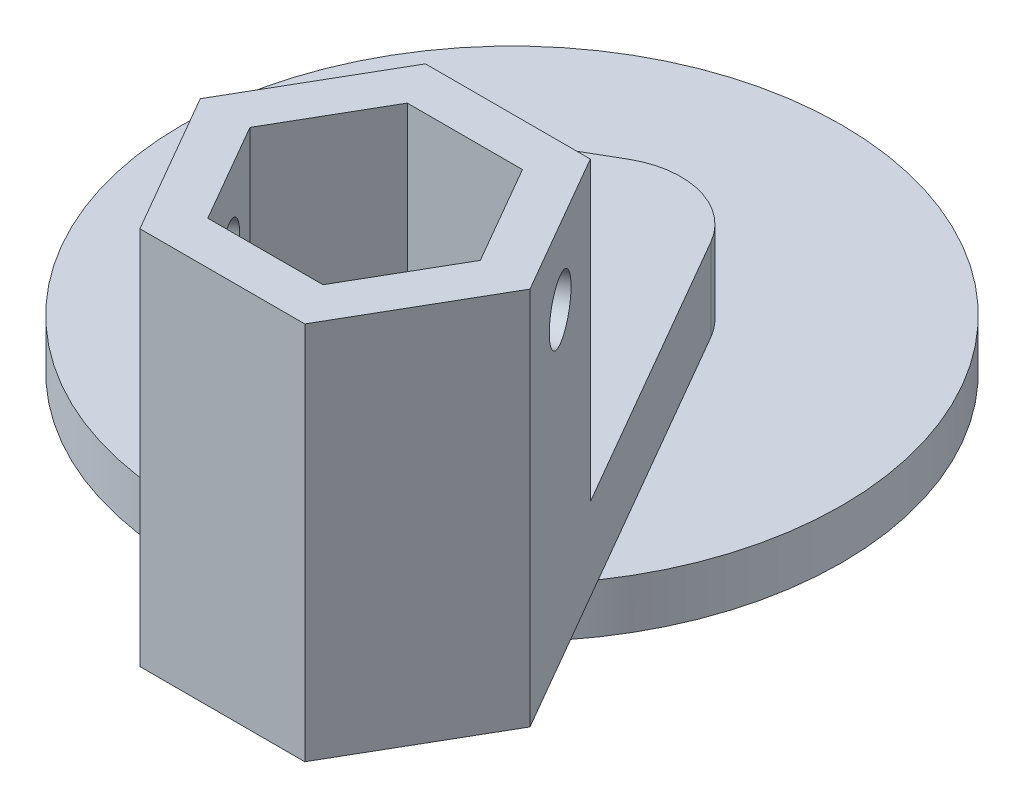
ISO-10303-21;
HEADER;
FILE_DESCRIPTION(('STEP AP214'),'2;1');
FILE_NAME('part.step','',(''),(''),'','','');
FILE_SCHEMA(('AUTOMOTIVE_DESIGN { 1 0 10303 214 1 1 1 1 }'));
ENDSEC;
DATA;
#1=APPLICATION_CONTEXT('core data for automotive mechanical design processes');
#2=APPLICATION_PROTOCOL_DEFINITION('international standard','automotive_design',2000,#1);
#3=PRODUCT_CONTEXT('',#1,'mechanical');
#4=PRODUCT('Part','Part','',(#3));
#5=PRODUCT_RELATED_PRODUCT_CATEGORY('part','',(#4));
#6=PRODUCT_DEFINITION_FORMATION('','',#4);
#7=PRODUCT_DEFINITION_CONTEXT('part definition',#1,'design');
#8=PRODUCT_DEFINITION('design','',#6,#7);
#9=PRODUCT_DEFINITION_SHAPE('','',#8);
#10=(LENGTH_UNIT() NAMED_UNIT(*) SI_UNIT(.MILLI.,.METRE.));
#11=(NAMED_UNIT(*) PLANE_ANGLE_UNIT() SI_UNIT($,.RADIAN.));
#12=(NAMED_UNIT(*) SI_UNIT($,.STERADIAN.) SOLID_ANGLE_UNIT());
#13=UNCERTAINTY_MEASURE_WITH_UNIT(LENGTH_MEASURE(1.E-05),#10,'distance_accuracy_value','');
#14=(GEOMETRIC_REPRESENTATION_CONTEXT(3) GLOBAL_UNCERTAINTY_ASSIGNED_CONTEXT((#13)) GLOBAL_UNIT_ASSIGNED_CONTEXT((#10,
#11,#12)) REPRESENTATION_CONTEXT('',''));
#15=CARTESIAN_POINT('',(0.,0.,0.));
#16=DIRECTION('',(0.,0.,1.));
#17=DIRECTION('',(1.,0.,0.));
#18=AXIS2_PLACEMENT_3D('',#15,#16,#17);
#19=CARTESIAN_POINT('',(5.,-18.,8.66025403784439));
#20=DIRECTION('',(0.866025403784439,0.,0.5));
#21=DIRECTION('',(0.5,0.,-0.866025403784439));
#22=AXIS2_PLACEMENT_3D('',#19,#20,#21);
#23=PLANE('',#22);
#24=DIRECTION('',(0.5,0.,-0.866025403784439));
#25=VECTOR('',#24,1.);
#26=CARTESIAN_POINT('',(5.,0.,8.66025403784439));
#27=LINE('',#26,#25);
#28=CARTESIAN_POINT('',(5.,0.,8.66025403784439));
#29=VERTEX_POINT('',#28);
#30=CARTESIAN_POINT('',(10.,0.,0.));
#31=VERTEX_POINT('',#30);
#32=EDGE_CURVE('E242',#29,#31,#27,.T.);
#33=ORIENTED_EDGE('',*,*,#32,.F.);
#34=DIRECTION('',(0.,1.,0.));
#35=VECTOR('',#34,1.);
#36=CARTESIAN_POINT('',(5.,-18.,8.66025403784439));
#37=LINE('',#36,#35);
#38=CARTESIAN_POINT('',(5.,-23.,8.66025403784439));
#39=VERTEX_POINT('',#38);
#40=EDGE_CURVE('E277',#39,#29,#37,.T.);
#41=ORIENTED_EDGE('',*,*,#40,.F.);
#42=DIRECTION('',(-0.5,0.,0.866025403784439));
#43=VECTOR('',#42,1.);
#44=CARTESIAN_POINT('',(7.5,-23.,4.33012701892219));
#45=LINE('',#44,#43);
#46=CARTESIAN_POINT('',(10.,-23.,0.));
#47=VERTEX_POINT('',#46);
#48=EDGE_CURVE('E192',#47,#39,#45,.T.);
#49=ORIENTED_EDGE('',*,*,#48,.F.);
#50=DIRECTION('',(0.,1.,0.));
#51=VECTOR('',#50,1.);
#52=CARTESIAN_POINT('',(10.,-18.,0.));
#53=LINE('',#52,#51);
#54=EDGE_CURVE('E260',#47,#31,#53,.T.);
#55=ORIENTED_EDGE('',*,*,#54,.T.);
#56=EDGE_LOOP('',(#33,#41,#49,#55));
#57=FACE_BOUND('',#56,.T.);
#58=ADVANCED_FACE('F37',(#57),#23,.T.);
#59=CARTESIAN_POINT('',(-5.,-18.,8.66025403784439));
#60=DIRECTION('',(0.,0.,1.));
#61=DIRECTION('',(1.,0.,0.));
#62=AXIS2_PLACEMENT_3D('',#59,#60,#61);
#63=PLANE('',#62);
#64=DIRECTION('',(1.,0.,0.));
#65=VECTOR('',#64,1.);
#66=CARTESIAN_POINT('',(-5.,0.,8.66025403784439));
#67=LINE('',#66,#65);
#68=CARTESIAN_POINT('',(-5.,0.,8.66025403784439));
#69=VERTEX_POINT('',#68);
#70=EDGE_CURVE('E257',#69,#29,#67,.T.);
#71=ORIENTED_EDGE('',*,*,#70,.F.);
#72=DIRECTION('',(0.,1.,0.));
#73=VECTOR('',#72,1.);
#74=CARTESIAN_POINT('',(-5.,-18.,8.66025403784439));
#75=LINE('',#74,#73);
#76=CARTESIAN_POINT('',(-5.,-23.,8.66025403784439));
#77=VERTEX_POINT('',#76);
#78=EDGE_CURVE('E280',#77,#69,#75,.T.);
#79=ORIENTED_EDGE('',*,*,#78,.F.);
#80=DIRECTION('',(-1.,0.,0.));
#81=VECTOR('',#80,1.);
#82=CARTESIAN_POINT('',(0.,-23.,8.66025403784439));
#83=LINE('',#82,#81);
#84=EDGE_CURVE('E161',#39,#77,#83,.T.);
#85=ORIENTED_EDGE('',*,*,#84,.F.);
#86=ORIENTED_EDGE('',*,*,#40,.T.);
#87=EDGE_LOOP('',(#71,#79,#85,#86));
#88=FACE_BOUND('',#87,.T.);
#89=ADVANCED_FACE('F338',(#88),#63,.T.);
#90=CARTESIAN_POINT('',(-10.,-18.,0.));
#91=DIRECTION('',(-0.866025403784439,0.,0.5));
#92=DIRECTION('',(0.5,0.,0.866025403784439));
#93=AXIS2_PLACEMENT_3D('',#90,#91,#92);
#94=PLANE('',#93);
#95=CARTESIAN_POINT('',(-7.5,-4.5,4.3301270189222));
#96=DIRECTION('',(-0.866025403784439,0.,0.5));
#97=DIRECTION('',(0.5,0.,0.866025403784439));
#98=AXIS2_PLACEMENT_3D('',#95,#96,#97);
#99=CIRCLE('',#98,1.8);
#100=CARTESIAN_POINT('',(-6.6,-4.5,5.88897274573419));
#101=VERTEX_POINT('',#100);
#102=EDGE_CURVE('E207',#101,#101,#99,.T.);
#103=ORIENTED_EDGE('',*,*,#102,.F.);
#104=EDGE_LOOP('',(#103));
#105=FACE_BOUND('',#104,.T.);
#106=DIRECTION('',(0.5,0.,0.866025403784439));
#107=VECTOR('',#106,1.);
#108=CARTESIAN_POINT('',(-22.5000000000001,-18.,-21.6506350946111));
#109=LINE('',#108,#107);
#110=CARTESIAN_POINT('',(-20.0000000000001,-18.,-17.3205080756889));
#111=VERTEX_POINT('',#110);
#112=CARTESIAN_POINT('',(-10.,-18.,0.));
#113=VERTEX_POINT('',#112);
#114=EDGE_CURVE('E188',#111,#113,#109,.T.);
#115=ORIENTED_EDGE('',*,*,#114,.F.);
#116=DIRECTION('',(0.,1.,0.));
#117=VECTOR('',#116,1.);
#118=CARTESIAN_POINT('',(-20.0000000000001,-23.,-17.3205080756889));
#119=LINE('',#118,#117);
#120=CARTESIAN_POINT('',(-20.0000000000001,-23.,-17.3205080756889));
#121=VERTEX_POINT('',#120);
#122=EDGE_CURVE('E45',#111,#121,#119,.F.);
#123=ORIENTED_EDGE('',*,*,#122,.T.);
#124=DIRECTION('',(-0.5,0.,-0.866025403784439));
#125=VECTOR('',#124,1.);
#126=CARTESIAN_POINT('',(-7.5,-23.,4.3301270189222));
#127=LINE('',#126,#125);
#128=CARTESIAN_POINT('',(-10.6559947924179,-23.,-1.13621630996842));
#129=VERTEX_POINT('',#128);
#130=EDGE_CURVE('E163',#129,#121,#127,.T.);
#131=ORIENTED_EDGE('',*,*,#130,.F.);
#132=EDGE_CURVE('E156',#77,#129,#127,.T.);
#133=ORIENTED_EDGE('',*,*,#132,.F.);
#134=ORIENTED_EDGE('',*,*,#78,.T.);
#135=DIRECTION('',(0.5,0.,0.866025403784439));
#136=VECTOR('',#135,1.);
#137=CARTESIAN_POINT('',(-10.,0.,0.));
#138=LINE('',#137,#136);
#139=CARTESIAN_POINT('',(-10.,0.,0.));
#140=VERTEX_POINT('',#139);
#141=EDGE_CURVE('E272',#140,#69,#138,.T.);
#142=ORIENTED_EDGE('',*,*,#141,.F.);
#143=DIRECTION('',(0.,1.,0.));
#144=VECTOR('',#143,1.);
#145=CARTESIAN_POINT('',(-10.,-18.,0.));
#146=LINE('',#145,#144);
#147=EDGE_CURVE('E282',#113,#140,#146,.T.);
#148=ORIENTED_EDGE('',*,*,#147,.F.);
#149=EDGE_LOOP('',(#115,#123,#131,#133,#134,#142,#148));
#150=FACE_BOUND('',#149,.T.);
#151=ADVANCED_FACE('F167',(#105,#150),#94,.T.);
#152=CARTESIAN_POINT('',(-5.,-18.,-8.66025403784439));
#153=DIRECTION('',(-0.866025403784439,0.,-0.5));
#154=DIRECTION('',(-0.5,0.,0.866025403784439));
#155=AXIS2_PLACEMENT_3D('',#152,#153,#154);
#156=PLANE('',#155);
#157=DIRECTION('',(-0.5,0.,0.866025403784439));
#158=VECTOR('',#157,1.);
#159=CARTESIAN_POINT('',(-5.,0.,-8.66025403784439));
#160=LINE('',#159,#158);
#161=CARTESIAN_POINT('',(-5.,0.,-8.66025403784439));
#162=VERTEX_POINT('',#161);
#163=EDGE_CURVE('E269',#162,#140,#160,.T.);
#164=ORIENTED_EDGE('',*,*,#163,.F.);
#165=DIRECTION('',(0.,1.,0.));
#166=VECTOR('',#165,1.);
#167=CARTESIAN_POINT('',(-5.,-18.,-8.66025403784439));
#168=LINE('',#167,#166);
#169=CARTESIAN_POINT('',(-5.,-18.,-8.66025403784439));
#170=VERTEX_POINT('',#169);
#171=EDGE_CURVE('E284',#170,#162,#168,.T.);
#172=ORIENTED_EDGE('',*,*,#171,.F.);
#173=DIRECTION('',(-0.5,0.,0.866025403784439));
#174=VECTOR('',#173,1.);
#175=CARTESIAN_POINT('',(-5.,-18.,-8.66025403784439));
#176=LINE('',#175,#174);
#177=EDGE_CURVE('E256',#170,#113,#176,.T.);
#178=ORIENTED_EDGE('',*,*,#177,.T.);
#179=ORIENTED_EDGE('',*,*,#147,.T.);
#180=EDGE_LOOP('',(#164,#172,#178,#179));
#181=FACE_BOUND('',#180,.T.);
#182=ADVANCED_FACE('F340',(#181),#156,.T.);
#183=CARTESIAN_POINT('',(5.,-18.,-8.66025403784439));
#184=DIRECTION('',(0.,0.,-1.));
#185=DIRECTION('',(-1.,0.,0.));
#186=AXIS2_PLACEMENT_3D('',#183,#184,#185);
#187=PLANE('',#186);
#188=DIRECTION('',(-1.,0.,0.));
#189=VECTOR('',#188,1.);
#190=CARTESIAN_POINT('',(5.,0.,-8.66025403784439));
#191=LINE('',#190,#189);
#192=CARTESIAN_POINT('',(5.,0.,-8.66025403784439));
#193=VERTEX_POINT('',#192);
#194=EDGE_CURVE('E266',#193,#162,#191,.T.);
#195=ORIENTED_EDGE('',*,*,#194,.F.);
#196=DIRECTION('',(0.,1.,0.));
#197=VECTOR('',#196,1.);
#198=CARTESIAN_POINT('',(5.,-18.,-8.66025403784439));
#199=LINE('',#198,#197);
#200=CARTESIAN_POINT('',(5.,-18.,-8.66025403784439));
#201=VERTEX_POINT('',#200);
#202=EDGE_CURVE('E286',#201,#193,#199,.T.);
#203=ORIENTED_EDGE('',*,*,#202,.F.);
#204=DIRECTION('',(-1.,0.,0.));
#205=VECTOR('',#204,1.);
#206=CARTESIAN_POINT('',(5.,-18.,-8.66025403784439));
#207=LINE('',#206,#205);
#208=EDGE_CURVE('E253',#201,#170,#207,.T.);
#209=ORIENTED_EDGE('',*,*,#208,.T.);
#210=ORIENTED_EDGE('',*,*,#171,.T.);
#211=EDGE_LOOP('',(#195,#203,#209,#210));
#212=FACE_BOUND('',#211,.T.);
#213=ADVANCED_FACE('F327',(#212),#187,.T.);
#214=CARTESIAN_POINT('',(10.,-18.,0.));
#215=DIRECTION('',(0.866025403784439,0.,-0.5));
#216=DIRECTION('',(-0.5,0.,-0.866025403784439));
#217=AXIS2_PLACEMENT_3D('',#214,#215,#216);
#218=PLANE('',#217);
#219=CARTESIAN_POINT('',(7.50000000000001,-4.5,-4.3301270189222));
#220=DIRECTION('',(0.866025403784439,0.,-0.5));
#221=DIRECTION('',(-0.5,0.,-0.866025403784439));
#222=AXIS2_PLACEMENT_3D('',#219,#220,#221);
#223=CIRCLE('',#222,1.8);
#224=CARTESIAN_POINT('',(6.6,-4.5,-5.88897274573419));
#225=VERTEX_POINT('',#224);
#226=EDGE_CURVE('E198',#225,#225,#223,.T.);
#227=ORIENTED_EDGE('',*,*,#226,.F.);
#228=EDGE_LOOP('',(#227));
#229=FACE_BOUND('',#228,.T.);
#230=DIRECTION('',(0.5,0.,0.866025403784439));
#231=VECTOR('',#230,1.);
#232=CARTESIAN_POINT('',(7.5,-23.,-4.33012701892219));
#233=LINE('',#232,#231);
#234=CARTESIAN_POINT('',(-5.00000000000009,-23.,-25.9807621135333));
#235=VERTEX_POINT('',#234);
#236=CARTESIAN_POINT('',(4.34400520758209,-23.,-9.79647034781281));
#237=VERTEX_POINT('',#236);
#238=EDGE_CURVE('E174',#235,#237,#233,.T.);
#239=ORIENTED_EDGE('',*,*,#238,.F.);
#240=DIRECTION('',(0.,-1.,0.));
#241=VECTOR('',#240,1.);
#242=CARTESIAN_POINT('',(-5.00000000000008,-18.,-25.9807621135333));
#243=LINE('',#242,#241);
#244=CARTESIAN_POINT('',(-5.00000000000008,-18.,-25.9807621135333));
#245=VERTEX_POINT('',#244);
#246=EDGE_CURVE('E295',#235,#245,#243,.F.);
#247=ORIENTED_EDGE('',*,*,#246,.T.);
#248=DIRECTION('',(0.5,0.,0.866025403784439));
#249=VECTOR('',#248,1.);
#250=CARTESIAN_POINT('',(-7.50000000000008,-18.,-30.3108891324555));
#251=LINE('',#250,#249);
#252=EDGE_CURVE('E186',#245,#201,#251,.T.);
#253=ORIENTED_EDGE('',*,*,#252,.T.);
#254=ORIENTED_EDGE('',*,*,#202,.T.);
#255=DIRECTION('',(-0.5,0.,-0.866025403784439));
#256=VECTOR('',#255,1.);
#257=CARTESIAN_POINT('',(10.,0.,0.));
#258=LINE('',#257,#256);
#259=EDGE_CURVE('E263',#31,#193,#258,.T.);
#260=ORIENTED_EDGE('',*,*,#259,.F.);
#261=ORIENTED_EDGE('',*,*,#54,.F.);
#262=EDGE_CURVE('E193',#237,#47,#233,.T.);
#263=ORIENTED_EDGE('',*,*,#262,.F.);
#264=EDGE_LOOP('',(#239,#247,#253,#254,#260,#261,#263));
#265=FACE_BOUND('',#264,.T.);
#266=ADVANCED_FACE('F322',(#229,#265),#218,.T.);
#267=CARTESIAN_POINT('',(0.,0.,0.));
#268=DIRECTION('',(0.,1.,0.));
#269=DIRECTION('',(0.,0.,1.));
#270=AXIS2_PLACEMENT_3D('',#267,#268,#269);
#271=PLANE('',#270);
#272=DIRECTION('',(0.5,0.,-0.866025403784439));
#273=VECTOR('',#272,1.);
#274=CARTESIAN_POINT('',(3.49296912859724,0.,6.05000000000001));
#275=LINE('',#274,#273);
#276=CARTESIAN_POINT('',(3.49296912859724,0.,6.05000000000001));
#277=VERTEX_POINT('',#276);
#278=CARTESIAN_POINT('',(6.98593825719448,0.,0.));
#279=VERTEX_POINT('',#278);
#280=EDGE_CURVE('E210',#277,#279,#275,.T.);
#281=ORIENTED_EDGE('',*,*,#280,.F.);
#282=DIRECTION('',(1.,0.,0.));
#283=VECTOR('',#282,1.);
#284=CARTESIAN_POINT('',(-3.49296912859724,0.,6.05000000000001));
#285=LINE('',#284,#283);
#286=CARTESIAN_POINT('',(-3.49296912859724,0.,6.05000000000001));
#287=VERTEX_POINT('',#286);
#288=EDGE_CURVE('E214',#287,#277,#285,.T.);
#289=ORIENTED_EDGE('',*,*,#288,.F.);
#290=DIRECTION('',(0.5,0.,0.866025403784438));
#291=VECTOR('',#290,1.);
#292=CARTESIAN_POINT('',(-6.98593825719448,0.,0.));
#293=LINE('',#292,#291);
#294=CARTESIAN_POINT('',(-6.98593825719448,0.,0.));
#295=VERTEX_POINT('',#294);
#296=EDGE_CURVE('E235',#295,#287,#293,.T.);
#297=ORIENTED_EDGE('',*,*,#296,.F.);
#298=DIRECTION('',(-0.5,0.,0.866025403784439));
#299=VECTOR('',#298,1.);
#300=CARTESIAN_POINT('',(-3.49296912859724,0.,-6.05000000000001));
#301=LINE('',#300,#299);
#302=CARTESIAN_POINT('',(-3.49296912859724,0.,-6.05000000000001));
#303=VERTEX_POINT('',#302);
#304=EDGE_CURVE('E232',#303,#295,#301,.T.);
#305=ORIENTED_EDGE('',*,*,#304,.F.);
#306=DIRECTION('',(-1.,0.,0.));
#307=VECTOR('',#306,1.);
#308=CARTESIAN_POINT('',(3.49296912859724,0.,-6.05000000000001));
#309=LINE('',#308,#307);
#310=CARTESIAN_POINT('',(3.49296912859724,0.,-6.05000000000001));
#311=VERTEX_POINT('',#310);
#312=EDGE_CURVE('E229',#311,#303,#309,.T.);
#313=ORIENTED_EDGE('',*,*,#312,.F.);
#314=DIRECTION('',(-0.5,0.,-0.866025403784439));
#315=VECTOR('',#314,1.);
#316=CARTESIAN_POINT('',(6.98593825719448,0.,0.));
#317=LINE('',#316,#315);
#318=EDGE_CURVE('E226',#279,#311,#317,.T.);
#319=ORIENTED_EDGE('',*,*,#318,.F.);
#320=EDGE_LOOP('',(#281,#289,#297,#305,#313,#319));
#321=FACE_BOUND('',#320,.T.);
#322=ORIENTED_EDGE('',*,*,#32,.T.);
#323=ORIENTED_EDGE('',*,*,#259,.T.);
#324=ORIENTED_EDGE('',*,*,#194,.T.);
#325=ORIENTED_EDGE('',*,*,#163,.T.);
#326=ORIENTED_EDGE('',*,*,#141,.T.);
#327=ORIENTED_EDGE('',*,*,#70,.T.);
#328=EDGE_LOOP('',(#322,#323,#324,#325,#326,#327));
#329=FACE_BOUND('',#328,.T.);
#330=ADVANCED_FACE('F334',(#321,#329),#271,.T.);
#331=CARTESIAN_POINT('',(3.49296912859724,-18.,6.05000000000001));
#332=DIRECTION('',(0.866025403784439,0.,0.5));
#333=DIRECTION('',(0.5,0.,-0.866025403784439));
#334=AXIS2_PLACEMENT_3D('',#331,#332,#333);
#335=PLANE('',#334);
#336=ORIENTED_EDGE('',*,*,#280,.T.);
#337=DIRECTION('',(0.,1.,0.));
#338=VECTOR('',#337,1.);
#339=CARTESIAN_POINT('',(6.98593825719448,-18.,0.));
#340=LINE('',#339,#338);
#341=CARTESIAN_POINT('',(6.98593825719448,-18.,0.));
#342=VERTEX_POINT('',#341);
#343=EDGE_CURVE('E224',#342,#279,#340,.T.);
#344=ORIENTED_EDGE('',*,*,#343,.F.);
#345=DIRECTION('',(0.5,0.,-0.866025403784439));
#346=VECTOR('',#345,1.);
#347=CARTESIAN_POINT('',(3.49296912859724,-18.,6.05000000000001));
#348=LINE('',#347,#346);
#349=CARTESIAN_POINT('',(3.49296912859724,-18.,6.05000000000001));
#350=VERTEX_POINT('',#349);
#351=EDGE_CURVE('E211',#350,#342,#348,.T.);
#352=ORIENTED_EDGE('',*,*,#351,.F.);
#353=DIRECTION('',(0.,1.,0.));
#354=VECTOR('',#353,1.);
#355=CARTESIAN_POINT('',(3.49296912859724,-18.,6.05000000000001));
#356=LINE('',#355,#354);
#357=EDGE_CURVE('E240',#350,#277,#356,.T.);
#358=ORIENTED_EDGE('',*,*,#357,.T.);
#359=EDGE_LOOP('',(#336,#344,#352,#358));
#360=FACE_BOUND('',#359,.T.);
#361=ADVANCED_FACE('F388',(#360),#335,.F.);
#362=CARTESIAN_POINT('',(-3.49296912859724,-18.,6.05000000000001));
#363=DIRECTION('',(0.,0.,1.));
#364=DIRECTION('',(1.,0.,0.));
#365=AXIS2_PLACEMENT_3D('',#362,#363,#364);
#366=PLANE('',#365);
#367=ORIENTED_EDGE('',*,*,#288,.T.);
#368=ORIENTED_EDGE('',*,*,#357,.F.);
#369=DIRECTION('',(1.,0.,0.));
#370=VECTOR('',#369,1.);
#371=CARTESIAN_POINT('',(-3.49296912859724,-18.,6.05000000000001));
#372=LINE('',#371,#370);
#373=CARTESIAN_POINT('',(-3.49296912859724,-18.,6.05000000000001));
#374=VERTEX_POINT('',#373);
#375=EDGE_CURVE('E222',#374,#350,#372,.T.);
#376=ORIENTED_EDGE('',*,*,#375,.F.);
#377=DIRECTION('',(0.,1.,0.));
#378=VECTOR('',#377,1.);
#379=CARTESIAN_POINT('',(-3.49296912859724,-18.,6.05000000000001));
#380=LINE('',#379,#378);
#381=EDGE_CURVE('E243',#374,#287,#380,.T.);
#382=ORIENTED_EDGE('',*,*,#381,.T.);
#383=EDGE_LOOP('',(#367,#368,#376,#382));
#384=FACE_BOUND('',#383,.T.);
#385=ADVANCED_FACE('F384',(#384),#366,.F.);
#386=CARTESIAN_POINT('',(-6.98593825719448,-18.,0.));
#387=DIRECTION('',(-0.866025403784439,0.,0.5));
#388=DIRECTION('',(0.5,0.,0.866025403784439));
#389=AXIS2_PLACEMENT_3D('',#386,#387,#388);
#390=PLANE('',#389);
#391=CARTESIAN_POINT('',(-5.23945369289586,-4.5,3.02500000000001));
#392=DIRECTION('',(-0.866025403784439,0.,0.5));
#393=DIRECTION('',(0.5,0.,0.866025403784439));
#394=AXIS2_PLACEMENT_3D('',#391,#392,#393);
#395=CIRCLE('',#394,1.8);
#396=CARTESIAN_POINT('',(-4.33945369289586,-4.5,4.583845726812));
#397=VERTEX_POINT('',#396);
#398=EDGE_CURVE('E204',#397,#397,#395,.T.);
#399=ORIENTED_EDGE('',*,*,#398,.T.);
#400=EDGE_LOOP('',(#399));
#401=FACE_BOUND('',#400,.T.);
#402=ORIENTED_EDGE('',*,*,#296,.T.);
#403=ORIENTED_EDGE('',*,*,#381,.F.);
#404=DIRECTION('',(0.5,0.,0.866025403784438));
#405=VECTOR('',#404,1.);
#406=CARTESIAN_POINT('',(-6.98593825719448,-18.,0.));
#407=LINE('',#406,#405);
#408=CARTESIAN_POINT('',(-6.98593825719448,-18.,0.));
#409=VERTEX_POINT('',#408);
#410=EDGE_CURVE('E220',#409,#374,#407,.T.);
#411=ORIENTED_EDGE('',*,*,#410,.F.);
#412=DIRECTION('',(0.,1.,0.));
#413=VECTOR('',#412,1.);
#414=CARTESIAN_POINT('',(-6.98593825719448,-18.,0.));
#415=LINE('',#414,#413);
#416=EDGE_CURVE('E245',#409,#295,#415,.T.);
#417=ORIENTED_EDGE('',*,*,#416,.T.);
#418=EDGE_LOOP('',(#402,#403,#411,#417));
#419=FACE_BOUND('',#418,.T.);
#420=ADVANCED_FACE('F387',(#401,#419),#390,.F.);
#421=CARTESIAN_POINT('',(-3.49296912859724,-18.,-6.05000000000001));
#422=DIRECTION('',(-0.866025403784439,0.,-0.5));
#423=DIRECTION('',(-0.5,0.,0.866025403784439));
#424=AXIS2_PLACEMENT_3D('',#421,#422,#423);
#425=PLANE('',#424);
#426=ORIENTED_EDGE('',*,*,#304,.T.);
#427=ORIENTED_EDGE('',*,*,#416,.F.);
#428=DIRECTION('',(-0.5,0.,0.866025403784439));
#429=VECTOR('',#428,1.);
#430=CARTESIAN_POINT('',(-3.49296912859724,-18.,-6.05000000000001));
#431=LINE('',#430,#429);
#432=CARTESIAN_POINT('',(-3.49296912859724,-18.,-6.05000000000001));
#433=VERTEX_POINT('',#432);
#434=EDGE_CURVE('E218',#433,#409,#431,.T.);
#435=ORIENTED_EDGE('',*,*,#434,.F.);
#436=DIRECTION('',(0.,1.,0.));
#437=VECTOR('',#436,1.);
#438=CARTESIAN_POINT('',(-3.49296912859724,-18.,-6.05000000000001));
#439=LINE('',#438,#437);
#440=EDGE_CURVE('E247',#433,#303,#439,.T.);
#441=ORIENTED_EDGE('',*,*,#440,.T.);
#442=EDGE_LOOP('',(#426,#427,#435,#441));
#443=FACE_BOUND('',#442,.T.);
#444=ADVANCED_FACE('F392',(#443),#425,.F.);
#445=CARTESIAN_POINT('',(3.49296912859724,-18.,-6.05000000000001));
#446=DIRECTION('',(0.,0.,-1.));
#447=DIRECTION('',(-1.,0.,0.));
#448=AXIS2_PLACEMENT_3D('',#445,#446,#447);
#449=PLANE('',#448);
#450=ORIENTED_EDGE('',*,*,#312,.T.);
#451=ORIENTED_EDGE('',*,*,#440,.F.);
#452=DIRECTION('',(-1.,0.,0.));
#453=VECTOR('',#452,1.);
#454=CARTESIAN_POINT('',(3.49296912859724,-18.,-6.05000000000001));
#455=LINE('',#454,#453);
#456=CARTESIAN_POINT('',(3.49296912859724,-18.,-6.05000000000001));
#457=VERTEX_POINT('',#456);
#458=EDGE_CURVE('E216',#457,#433,#455,.T.);
#459=ORIENTED_EDGE('',*,*,#458,.F.);
#460=DIRECTION('',(0.,1.,0.));
#461=VECTOR('',#460,1.);
#462=CARTESIAN_POINT('',(3.49296912859724,-18.,-6.05000000000001));
#463=LINE('',#462,#461);
#464=EDGE_CURVE('E249',#457,#311,#463,.T.);
#465=ORIENTED_EDGE('',*,*,#464,.T.);
#466=EDGE_LOOP('',(#450,#451,#459,#465));
#467=FACE_BOUND('',#466,.T.);
#468=ADVANCED_FACE('F396',(#467),#449,.F.);
#469=CARTESIAN_POINT('',(6.98593825719448,-18.,0.));
#470=DIRECTION('',(0.866025403784439,0.,-0.5));
#471=DIRECTION('',(-0.5,0.,-0.866025403784439));
#472=AXIS2_PLACEMENT_3D('',#469,#470,#471);
#473=PLANE('',#472);
#474=CARTESIAN_POINT('',(5.23945369289586,-4.5,-3.025));
#475=DIRECTION('',(0.866025403784439,0.,-0.5));
#476=DIRECTION('',(-0.5,0.,-0.866025403784439));
#477=AXIS2_PLACEMENT_3D('',#474,#475,#476);
#478=CIRCLE('',#477,1.8);
#479=CARTESIAN_POINT('',(4.33945369289586,-4.5,-4.58384572681199));
#480=VERTEX_POINT('',#479);
#481=EDGE_CURVE('E203',#480,#480,#478,.T.);
#482=ORIENTED_EDGE('',*,*,#481,.T.);
#483=EDGE_LOOP('',(#482));
#484=FACE_BOUND('',#483,.T.);
#485=ORIENTED_EDGE('',*,*,#318,.T.);
#486=ORIENTED_EDGE('',*,*,#464,.F.);
#487=DIRECTION('',(-0.5,0.,-0.866025403784439));
#488=VECTOR('',#487,1.);
#489=CARTESIAN_POINT('',(6.98593825719448,-18.,0.));
#490=LINE('',#489,#488);
#491=EDGE_CURVE('E213',#342,#457,#490,.T.);
#492=ORIENTED_EDGE('',*,*,#491,.F.);
#493=ORIENTED_EDGE('',*,*,#343,.T.);
#494=EDGE_LOOP('',(#485,#486,#492,#493));
#495=FACE_BOUND('',#494,.T.);
#496=ADVANCED_FACE('F400',(#484,#495),#473,.F.);
#497=CARTESIAN_POINT('',(-7.50389012056539,-4.5,4.33237298107781));
#498=DIRECTION('',(0.866025403784438,0.,-0.5));
#499=DIRECTION('',(-0.5,0.,-0.866025403784439));
#500=AXIS2_PLACEMENT_3D('',#497,#498,#499);
#501=CYLINDRICAL_SURFACE('',#500,1.8);
#502=ORIENTED_EDGE('',*,*,#226,.T.);
#503=EDGE_LOOP('',(#502));
#504=FACE_BOUND('',#503,.T.);
#505=ORIENTED_EDGE('',*,*,#481,.F.);
#506=EDGE_LOOP('',(#505));
#507=FACE_BOUND('',#506,.T.);
#508=ADVANCED_FACE('F382',(#504,#507),#501,.F.);
#509=ORIENTED_EDGE('',*,*,#102,.T.);
#510=EDGE_LOOP('',(#509));
#511=FACE_BOUND('',#510,.T.);
#512=ORIENTED_EDGE('',*,*,#398,.F.);
#513=EDGE_LOOP('',(#512));
#514=FACE_BOUND('',#513,.T.);
#515=ADVANCED_FACE('F375',(#511,#514),#501,.F.);
#516=CARTESIAN_POINT('',(0.,-18.,0.));
#517=DIRECTION('',(0.,-1.,0.));
#518=DIRECTION('',(0.,0.,-1.));
#519=AXIS2_PLACEMENT_3D('',#516,#517,#518);
#520=PLANE('',#519);
#521=CARTESIAN_POINT('',(0.,-18.,0.));
#522=DIRECTION('',(0.,-1.,0.));
#523=DIRECTION('',(0.,0.,-1.));
#524=AXIS2_PLACEMENT_3D('',#521,#522,#523);
#525=CIRCLE('',#524,1.75);
#526=CARTESIAN_POINT('',(0.,-18.,-1.75));
#527=VERTEX_POINT('',#526);
#528=EDGE_CURVE('E190',#527,#527,#525,.T.);
#529=ORIENTED_EDGE('',*,*,#528,.T.);
#530=EDGE_LOOP('',(#529));
#531=FACE_BOUND('',#530,.T.);
#532=ORIENTED_EDGE('',*,*,#491,.T.);
#533=ORIENTED_EDGE('',*,*,#458,.T.);
#534=ORIENTED_EDGE('',*,*,#434,.T.);
#535=ORIENTED_EDGE('',*,*,#410,.T.);
#536=ORIENTED_EDGE('',*,*,#375,.T.);
#537=ORIENTED_EDGE('',*,*,#351,.T.);
#538=EDGE_LOOP('',(#532,#533,#534,#535,#536,#537));
#539=FACE_BOUND('',#538,.T.);
#540=ADVANCED_FACE('F372',(#531,#539),#520,.F.);
#541=CARTESIAN_POINT('',(0.,-23.,0.));
#542=DIRECTION('',(0.,1.,0.));
#543=DIRECTION('',(0.,0.,1.));
#544=AXIS2_PLACEMENT_3D('',#541,#542,#543);
#545=CYLINDRICAL_SURFACE('',#544,1.75);
#546=CARTESIAN_POINT('',(0.,-23.,0.));
#547=DIRECTION('',(0.,-1.,0.));
#548=DIRECTION('',(0.,0.,-1.));
#549=AXIS2_PLACEMENT_3D('',#546,#547,#548);
#550=CIRCLE('',#549,1.75);
#551=CARTESIAN_POINT('',(0.,-23.,-1.75));
#552=VERTEX_POINT('',#551);
#553=EDGE_CURVE('E162',#552,#552,#550,.T.);
#554=ORIENTED_EDGE('',*,*,#553,.T.);
#555=EDGE_LOOP('',(#554));
#556=FACE_BOUND('',#555,.T.);
#557=ORIENTED_EDGE('',*,*,#528,.F.);
#558=EDGE_LOOP('',(#557));
#559=FACE_BOUND('',#558,.T.);
#560=ADVANCED_FACE('F371',(#556,#559),#545,.F.);
#561=CARTESIAN_POINT('',(0.,-23.,0.));
#562=DIRECTION('',(0.,-1.,0.));
#563=DIRECTION('',(0.,0.,-1.));
#564=AXIS2_PLACEMENT_3D('',#561,#562,#563);
#565=PLANE('',#564);
#566=CARTESIAN_POINT('',(-12.1698729810779,-23.,-21.0788383248866));
#567=DIRECTION('',(0.,-1.,0.));
#568=DIRECTION('',(0.,0.,-1.));
#569=AXIS2_PLACEMENT_3D('',#566,#567,#568);
#570=CIRCLE('',#569,20.);
#571=EDGE_CURVE('E52',#237,#129,#570,.T.);
#572=ORIENTED_EDGE('',*,*,#571,.F.);
#573=ORIENTED_EDGE('',*,*,#262,.T.);
#574=ORIENTED_EDGE('',*,*,#48,.T.);
#575=ORIENTED_EDGE('',*,*,#84,.T.);
#576=ORIENTED_EDGE('',*,*,#132,.T.);
#577=EDGE_LOOP('',(#572,#573,#574,#575,#576));
#578=FACE_BOUND('',#577,.T.);
#579=ORIENTED_EDGE('',*,*,#553,.F.);
#580=EDGE_LOOP('',(#579));
#581=FACE_BOUND('',#580,.T.);
#582=ADVANCED_FACE('F157',(#578,#581),#565,.T.);
#583=CARTESIAN_POINT('',(-15.0000000000001,0.,-25.9807621135333));
#584=DIRECTION('',(0.5,0.,0.866025403784439));
#585=DIRECTION('',(0.866025403784439,0.,-0.5));
#586=AXIS2_PLACEMENT_3D('',#583,#584,#585);
#587=PLANE('',#586);
#588=DIRECTION('',(-0.866025403784439,0.,0.5));
#589=VECTOR('',#588,1.);
#590=CARTESIAN_POINT('',(-22.5000000000001,-23.,-21.6506350946111));
#591=LINE('',#590,#589);
#592=CARTESIAN_POINT('',(-11.8301270189223,-23.,-27.8108891324555));
#593=VERTEX_POINT('',#592);
#594=CARTESIAN_POINT('',(-18.1698729810779,-23.,-24.1506350946111));
#595=VERTEX_POINT('',#594);
#596=EDGE_CURVE('E184',#593,#595,#591,.T.);
#597=ORIENTED_EDGE('',*,*,#596,.T.);
#598=DIRECTION('',(0.,1.,0.));
#599=VECTOR('',#598,1.);
#600=CARTESIAN_POINT('',(-18.1698729810779,-18.,-24.1506350946111));
#601=LINE('',#600,#599);
#602=CARTESIAN_POINT('',(-18.1698729810779,-18.,-24.1506350946111));
#603=VERTEX_POINT('',#602);
#604=EDGE_CURVE('E300',#595,#603,#601,.T.);
#605=ORIENTED_EDGE('',*,*,#604,.T.);
#606=DIRECTION('',(0.866025403784439,0.,-0.5));
#607=VECTOR('',#606,1.);
#608=CARTESIAN_POINT('',(-22.5000000000001,-18.,-21.6506350946111));
#609=LINE('',#608,#607);
#610=CARTESIAN_POINT('',(-11.8301270189223,-18.,-27.8108891324555));
#611=VERTEX_POINT('',#610);
#612=EDGE_CURVE('E180',#603,#611,#609,.T.);
#613=ORIENTED_EDGE('',*,*,#612,.T.);
#614=DIRECTION('',(0.,-1.,0.));
#615=VECTOR('',#614,1.);
#616=CARTESIAN_POINT('',(-11.8301270189223,-23.,-27.8108891324555));
#617=LINE('',#616,#615);
#618=EDGE_CURVE('E279',#611,#593,#617,.T.);
#619=ORIENTED_EDGE('',*,*,#618,.T.);
#620=EDGE_LOOP('',(#597,#605,#613,#619));
#621=FACE_BOUND('',#620,.T.);
#622=ADVANCED_FACE('F314',(#621),#587,.F.);
#623=CARTESIAN_POINT('',(-22.5000000000001,-18.,-21.6506350946111));
#624=DIRECTION('',(0.,-1.,0.));
#625=DIRECTION('',(0.,0.,-1.));
#626=AXIS2_PLACEMENT_3D('',#623,#624,#625);
#627=PLANE('',#626);
#628=ORIENTED_EDGE('',*,*,#612,.F.);
#629=CARTESIAN_POINT('',(-15.6698729810779,-18.,-19.8205080756889));
#630=DIRECTION('',(0.,-1.,0.));
#631=DIRECTION('',(0.,0.,-1.));
#632=AXIS2_PLACEMENT_3D('',#629,#630,#631);
#633=CIRCLE('',#632,5.);
#634=EDGE_CURVE('E303',#603,#111,#633,.F.);
#635=ORIENTED_EDGE('',*,*,#634,.T.);
#636=ORIENTED_EDGE('',*,*,#114,.T.);
#637=ORIENTED_EDGE('',*,*,#177,.F.);
#638=ORIENTED_EDGE('',*,*,#208,.F.);
#639=ORIENTED_EDGE('',*,*,#252,.F.);
#640=CARTESIAN_POINT('',(-9.33012701892227,-18.,-23.4807621135333));
#641=DIRECTION('',(0.,-1.,0.));
#642=DIRECTION('',(0.,0.,-1.));
#643=AXIS2_PLACEMENT_3D('',#640,#641,#642);
#644=CIRCLE('',#643,5.);
#645=EDGE_CURVE('E297',#245,#611,#644,.F.);
#646=ORIENTED_EDGE('',*,*,#645,.T.);
#647=EDGE_LOOP('',(#628,#635,#636,#637,#638,#639,#646));
#648=FACE_BOUND('',#647,.T.);
#649=ADVANCED_FACE('F306',(#648),#627,.F.);
#650=CARTESIAN_POINT('',(-9.33012701892227,0.,-23.4807621135333));
#651=DIRECTION('',(0.,1.,0.));
#652=DIRECTION('',(0.,0.,1.));
#653=AXIS2_PLACEMENT_3D('',#650,#651,#652);
#654=CYLINDRICAL_SURFACE('',#653,5.);
#655=ORIENTED_EDGE('',*,*,#645,.F.);
#656=ORIENTED_EDGE('',*,*,#246,.F.);
#657=CARTESIAN_POINT('',(-9.33012701892227,-23.,-23.4807621135333));
#658=DIRECTION('',(0.,-1.,0.));
#659=DIRECTION('',(0.,0.,-1.));
#660=AXIS2_PLACEMENT_3D('',#657,#658,#659);
#661=CIRCLE('',#660,5.);
#662=EDGE_CURVE('E293',#593,#235,#661,.T.);
#663=ORIENTED_EDGE('',*,*,#662,.F.);
#664=ORIENTED_EDGE('',*,*,#618,.F.);
#665=EDGE_LOOP('',(#655,#656,#663,#664));
#666=FACE_BOUND('',#665,.T.);
#667=ADVANCED_FACE('F318',(#666),#654,.T.);
#668=CARTESIAN_POINT('',(-15.6698729810779,0.,-19.8205080756889));
#669=DIRECTION('',(0.,-1.,0.));
#670=DIRECTION('',(0.,0.,-1.));
#671=AXIS2_PLACEMENT_3D('',#668,#669,#670);
#672=CYLINDRICAL_SURFACE('',#671,5.);
#673=CARTESIAN_POINT('',(-15.6698729810779,-23.,-19.8205080756889));
#674=DIRECTION('',(0.,-1.,0.));
#675=DIRECTION('',(0.,0.,-1.));
#676=AXIS2_PLACEMENT_3D('',#673,#674,#675);
#677=CIRCLE('',#676,5.);
#678=EDGE_CURVE('E11',#121,#595,#677,.T.);
#679=ORIENTED_EDGE('',*,*,#678,.F.);
#680=ORIENTED_EDGE('',*,*,#122,.F.);
#681=ORIENTED_EDGE('',*,*,#634,.F.);
#682=ORIENTED_EDGE('',*,*,#604,.F.);
#683=EDGE_LOOP('',(#679,#680,#681,#682));
#684=FACE_BOUND('',#683,.T.);
#685=ADVANCED_FACE('F39',(#684),#672,.T.);
#686=CARTESIAN_POINT('',(-12.1698729810779,-23.,-21.0788383248866));
#687=DIRECTION('',(0.,-1.,0.));
#688=DIRECTION('',(0.,0.,-1.));
#689=AXIS2_PLACEMENT_3D('',#686,#687,#688);
#690=PLANE('',#689);
#691=EDGE_CURVE('E171',#129,#237,#570,.T.);
#692=ORIENTED_EDGE('',*,*,#691,.F.);
#693=ORIENTED_EDGE('',*,*,#130,.T.);
#694=ORIENTED_EDGE('',*,*,#678,.T.);
#695=ORIENTED_EDGE('',*,*,#596,.F.);
#696=ORIENTED_EDGE('',*,*,#662,.T.);
#697=ORIENTED_EDGE('',*,*,#238,.T.);
#698=EDGE_LOOP('',(#692,#693,#694,#695,#696,#697));
#699=FACE_BOUND('',#698,.T.);
#700=ADVANCED_FACE('F172',(#699),#690,.F.);
#701=CARTESIAN_POINT('',(-12.1698729810779,-26.,-21.0788383248866));
#702=DIRECTION('',(0.,1.,0.));
#703=DIRECTION('',(0.,0.,1.));
#704=AXIS2_PLACEMENT_3D('',#701,#702,#703);
#705=CYLINDRICAL_SURFACE('',#704,20.);
#706=CARTESIAN_POINT('',(-12.1698729810779,-26.,-21.0788383248866));
#707=DIRECTION('',(0.,-1.,0.));
#708=DIRECTION('',(0.,0.,-1.));
#709=AXIS2_PLACEMENT_3D('',#706,#707,#708);
#710=CIRCLE('',#709,20.);
#711=CARTESIAN_POINT('',(-12.1698729810779,-26.,-41.0788383248866));
#712=VERTEX_POINT('',#711);
#713=EDGE_CURVE('E178',#712,#712,#710,.T.);
#714=ORIENTED_EDGE('',*,*,#713,.F.);
#715=EDGE_LOOP('',(#714));
#716=FACE_BOUND('',#715,.T.);
#717=ORIENTED_EDGE('',*,*,#571,.T.);
#718=ORIENTED_EDGE('',*,*,#691,.T.);
#719=EDGE_LOOP('',(#717,#718));
#720=FACE_BOUND('',#719,.T.);
#721=ADVANCED_FACE('F177',(#716,#720),#705,.T.);
#722=CARTESIAN_POINT('',(-12.1698729810779,-26.,-21.0788383248866));
#723=DIRECTION('',(0.,-1.,0.));
#724=DIRECTION('',(0.,0.,-1.));
#725=AXIS2_PLACEMENT_3D('',#722,#723,#724);
#726=PLANE('',#725);
#727=ORIENTED_EDGE('',*,*,#713,.T.);
#728=EDGE_LOOP('',(#727));
#729=FACE_BOUND('',#728,.T.);
#730=ADVANCED_FACE('F495',(#729),#726,.T.);
#731=CLOSED_SHELL('',(#58,#89,#151,#182,#213,#266,#330,#361,#385,#420,#444,#468,#496,#508,#515,
#540,#560,#582,#622,#649,#667,#685,#700,#721,#730));
#732=MANIFOLD_SOLID_BREP('B2',#731);
#733=ADVANCED_BREP_SHAPE_REPRESENTATION('',(#18,#732),#14);
#734=SHAPE_DEFINITION_REPRESENTATION(#9,#733);
ENDSEC;
END-ISO-10303-21;
